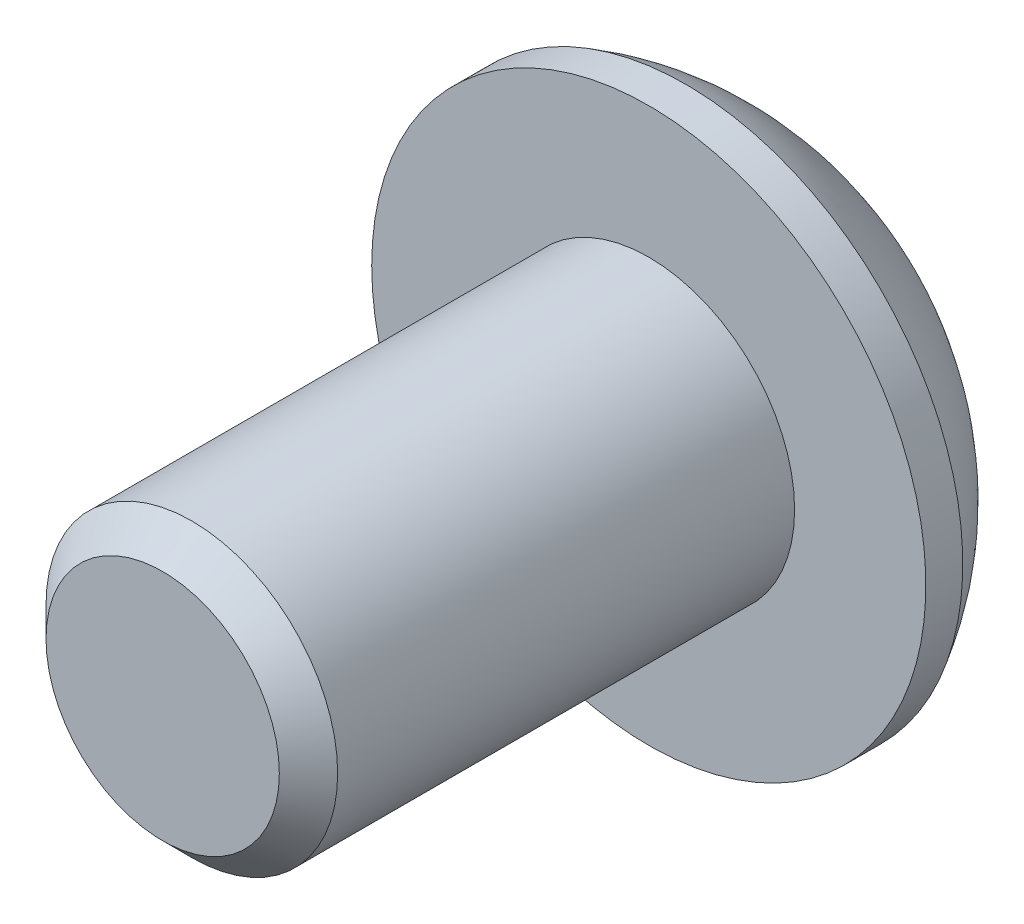
ISO-10303-21;
HEADER;
FILE_DESCRIPTION(('STEP AP214'),'2;1');
FILE_NAME('part.step','',(''),(''),'','','');
FILE_SCHEMA(('AUTOMOTIVE_DESIGN { 1 0 10303 214 1 1 1 1 }'));
ENDSEC;
DATA;
#1=APPLICATION_CONTEXT('core data for automotive mechanical design processes');
#2=APPLICATION_PROTOCOL_DEFINITION('international standard','automotive_design',2000,#1);
#3=PRODUCT_CONTEXT('',#1,'mechanical');
#4=PRODUCT('Part','Part','',(#3));
#5=PRODUCT_RELATED_PRODUCT_CATEGORY('part','',(#4));
#6=PRODUCT_DEFINITION_FORMATION('','',#4);
#7=PRODUCT_DEFINITION_CONTEXT('part definition',#1,'design');
#8=PRODUCT_DEFINITION('design','',#6,#7);
#9=PRODUCT_DEFINITION_SHAPE('','',#8);
#10=(LENGTH_UNIT() NAMED_UNIT(*) SI_UNIT(.MILLI.,.METRE.));
#11=(NAMED_UNIT(*) PLANE_ANGLE_UNIT() SI_UNIT($,.RADIAN.));
#12=(NAMED_UNIT(*) SI_UNIT($,.STERADIAN.) SOLID_ANGLE_UNIT());
#13=UNCERTAINTY_MEASURE_WITH_UNIT(LENGTH_MEASURE(1.E-05),#10,'distance_accuracy_value','');
#14=(GEOMETRIC_REPRESENTATION_CONTEXT(3) GLOBAL_UNCERTAINTY_ASSIGNED_CONTEXT((#13)) GLOBAL_UNIT_ASSIGNED_CONTEXT((#10,
#11,#12)) REPRESENTATION_CONTEXT('',''));
#15=CARTESIAN_POINT('',(0.,0.,0.));
#16=DIRECTION('',(0.,0.,1.));
#17=DIRECTION('',(1.,0.,0.));
#18=AXIS2_PLACEMENT_3D('',#15,#16,#17);
#19=CARTESIAN_POINT('',(0.,0.,-0.84));
#20=DIRECTION('',(0.,0.,1.));
#21=DIRECTION('',(1.,0.,0.));
#22=AXIS2_PLACEMENT_3D('',#19,#20,#21);
#23=PLANE('',#22);
#24=DIRECTION('',(0.,1.,0.));
#25=VECTOR('',#24,1.);
#26=CARTESIAN_POINT('',(-1.,-0.577350269189626,-0.84));
#27=LINE('',#26,#25);
#28=CARTESIAN_POINT('',(-1.,-0.577350269189626,-0.84));
#29=VERTEX_POINT('',#28);
#30=CARTESIAN_POINT('',(-1.,0.577350269189626,-0.84));
#31=VERTEX_POINT('',#30);
#32=EDGE_CURVE('E72',#29,#31,#27,.T.);
#33=ORIENTED_EDGE('',*,*,#32,.T.);
#34=DIRECTION('',(-0.866025403784439,-0.5,0.));
#35=VECTOR('',#34,1.);
#36=CARTESIAN_POINT('',(-1.,0.577350269189626,-0.84));
#37=LINE('',#36,#35);
#38=CARTESIAN_POINT('',(0.,1.15470053837925,-0.84));
#39=VERTEX_POINT('',#38);
#40=EDGE_CURVE('E143',#31,#39,#37,.F.);
#41=ORIENTED_EDGE('',*,*,#40,.T.);
#42=DIRECTION('',(-0.866025403784439,0.5,0.));
#43=VECTOR('',#42,1.);
#44=CARTESIAN_POINT('',(0.,1.15470053837925,-0.84));
#45=LINE('',#44,#43);
#46=CARTESIAN_POINT('',(1.,0.577350269189626,-0.84));
#47=VERTEX_POINT('',#46);
#48=EDGE_CURVE('E150',#39,#47,#45,.F.);
#49=ORIENTED_EDGE('',*,*,#48,.T.);
#50=DIRECTION('',(0.,1.,0.));
#51=VECTOR('',#50,1.);
#52=CARTESIAN_POINT('',(1.,0.577350269189626,-0.84));
#53=LINE('',#52,#51);
#54=CARTESIAN_POINT('',(1.,-0.577350269189626,-0.84));
#55=VERTEX_POINT('',#54);
#56=EDGE_CURVE('E155',#47,#55,#53,.F.);
#57=ORIENTED_EDGE('',*,*,#56,.T.);
#58=DIRECTION('',(0.866025403784439,0.499999999999999,0.));
#59=VECTOR('',#58,1.);
#60=CARTESIAN_POINT('',(1.,-0.577350269189626,-0.84));
#61=LINE('',#60,#59);
#62=CARTESIAN_POINT('',(0.,-1.15470053837925,-0.84));
#63=VERTEX_POINT('',#62);
#64=EDGE_CURVE('E68',#55,#63,#61,.F.);
#65=ORIENTED_EDGE('',*,*,#64,.T.);
#66=DIRECTION('',(0.866025403784438,-0.5,0.));
#67=VECTOR('',#66,1.);
#68=CARTESIAN_POINT('',(0.,-1.15470053837925,-0.84));
#69=LINE('',#68,#67);
#70=EDGE_CURVE('E70',#63,#29,#69,.F.);
#71=ORIENTED_EDGE('',*,*,#70,.T.);
#72=EDGE_LOOP('',(#33,#41,#49,#57,#65,#71));
#73=FACE_BOUND('',#72,.T.);
#74=ADVANCED_FACE('F16',(#73),#23,.F.);
#75=CARTESIAN_POINT('',(-1.,-0.577350269189626,-1.65));
#76=DIRECTION('',(-1.,0.,0.));
#77=DIRECTION('',(0.,0.,1.));
#78=AXIS2_PLACEMENT_3D('',#75,#76,#77);
#79=PLANE('',#78);
#80=ORIENTED_EDGE('',*,*,#32,.F.);
#81=DIRECTION('',(0.,0.,1.));
#82=VECTOR('',#81,1.);
#83=CARTESIAN_POINT('',(-0.999999999999999,-0.577350269189625,-1.65));
#84=LINE('',#83,#82);
#85=CARTESIAN_POINT('',(-1.,-0.577350269189626,-1.65));
#86=VERTEX_POINT('',#85);
#87=EDGE_CURVE('E78',#29,#86,#84,.F.);
#88=ORIENTED_EDGE('',*,*,#87,.T.);
#89=DIRECTION('',(0.,1.,0.));
#90=VECTOR('',#89,1.);
#91=CARTESIAN_POINT('',(-1.,-0.7125,-1.65));
#92=LINE('',#91,#90);
#93=CARTESIAN_POINT('',(-1.,0.577350269189626,-1.65));
#94=VERTEX_POINT('',#93);
#95=EDGE_CURVE('E138',#94,#86,#92,.F.);
#96=ORIENTED_EDGE('',*,*,#95,.F.);
#97=DIRECTION('',(0.,0.,1.));
#98=VECTOR('',#97,1.);
#99=CARTESIAN_POINT('',(-1.,0.577350269189626,-1.65));
#100=LINE('',#99,#98);
#101=EDGE_CURVE('E84',#94,#31,#100,.T.);
#102=ORIENTED_EDGE('',*,*,#101,.T.);
#103=EDGE_LOOP('',(#80,#88,#96,#102));
#104=FACE_BOUND('',#103,.T.);
#105=ADVANCED_FACE('F81',(#104),#79,.F.);
#106=CARTESIAN_POINT('',(0.,-1.15470053837925,-1.65));
#107=DIRECTION('',(-0.5,-0.866025403784438,0.));
#108=DIRECTION('',(0.866025403784438,-0.5,0.));
#109=AXIS2_PLACEMENT_3D('',#106,#107,#108);
#110=PLANE('',#109);
#111=ORIENTED_EDGE('',*,*,#70,.F.);
#112=DIRECTION('',(0.,0.,1.));
#113=VECTOR('',#112,1.);
#114=CARTESIAN_POINT('',(0.,-1.15470053837925,-1.65));
#115=LINE('',#114,#113);
#116=CARTESIAN_POINT('',(0.,-1.15470053837925,-1.65));
#117=VERTEX_POINT('',#116);
#118=EDGE_CURVE('E97',#63,#117,#115,.F.);
#119=ORIENTED_EDGE('',*,*,#118,.T.);
#120=DIRECTION('',(0.866025403784439,-0.499999999999999,0.));
#121=VECTOR('',#120,1.);
#122=CARTESIAN_POINT('',(-1.,-0.577350269189626,-1.65));
#123=LINE('',#122,#121);
#124=EDGE_CURVE('E90',#86,#117,#123,.T.);
#125=ORIENTED_EDGE('',*,*,#124,.F.);
#126=ORIENTED_EDGE('',*,*,#87,.F.);
#127=EDGE_LOOP('',(#111,#119,#125,#126));
#128=FACE_BOUND('',#127,.T.);
#129=ADVANCED_FACE('F88',(#128),#110,.F.);
#130=CARTESIAN_POINT('',(1.,-0.577350269189626,-1.65));
#131=DIRECTION('',(0.499999999999999,-0.866025403784439,0.));
#132=DIRECTION('',(0.866025403784439,0.499999999999999,0.));
#133=AXIS2_PLACEMENT_3D('',#130,#131,#132);
#134=PLANE('',#133);
#135=ORIENTED_EDGE('',*,*,#64,.F.);
#136=DIRECTION('',(0.,0.,-1.));
#137=VECTOR('',#136,1.);
#138=CARTESIAN_POINT('',(1.,-0.577350269189626,-1.65));
#139=LINE('',#138,#137);
#140=CARTESIAN_POINT('',(1.,-0.577350269189626,-1.65));
#141=VERTEX_POINT('',#140);
#142=EDGE_CURVE('E153',#55,#141,#139,.T.);
#143=ORIENTED_EDGE('',*,*,#142,.T.);
#144=DIRECTION('',(0.86602540378444,0.499999999999998,0.));
#145=VECTOR('',#144,1.);
#146=CARTESIAN_POINT('',(0.,-1.15470053837925,-1.65));
#147=LINE('',#146,#145);
#148=EDGE_CURVE('E132',#117,#141,#147,.T.);
#149=ORIENTED_EDGE('',*,*,#148,.F.);
#150=ORIENTED_EDGE('',*,*,#118,.F.);
#151=EDGE_LOOP('',(#135,#143,#149,#150));
#152=FACE_BOUND('',#151,.T.);
#153=ADVANCED_FACE('F160',(#152),#134,.F.);
#154=CARTESIAN_POINT('',(1.,0.577350269189626,-1.65));
#155=DIRECTION('',(1.,0.,0.));
#156=DIRECTION('',(0.,0.,-1.));
#157=AXIS2_PLACEMENT_3D('',#154,#155,#156);
#158=PLANE('',#157);
#159=ORIENTED_EDGE('',*,*,#56,.F.);
#160=DIRECTION('',(0.,0.,1.));
#161=VECTOR('',#160,1.);
#162=CARTESIAN_POINT('',(1.,0.577350269189625,-1.65));
#163=LINE('',#162,#161);
#164=CARTESIAN_POINT('',(1.,0.577350269189626,-1.65));
#165=VERTEX_POINT('',#164);
#166=EDGE_CURVE('E147',#47,#165,#163,.F.);
#167=ORIENTED_EDGE('',*,*,#166,.T.);
#168=DIRECTION('',(0.,1.,0.));
#169=VECTOR('',#168,1.);
#170=CARTESIAN_POINT('',(1.,-0.7125,-1.65));
#171=LINE('',#170,#169);
#172=EDGE_CURVE('E129',#141,#165,#171,.T.);
#173=ORIENTED_EDGE('',*,*,#172,.F.);
#174=ORIENTED_EDGE('',*,*,#142,.F.);
#175=EDGE_LOOP('',(#159,#167,#173,#174));
#176=FACE_BOUND('',#175,.T.);
#177=ADVANCED_FACE('F172',(#176),#158,.F.);
#178=CARTESIAN_POINT('',(0.,1.15470053837925,-1.65));
#179=DIRECTION('',(0.5,0.866025403784439,0.));
#180=DIRECTION('',(-0.866025403784439,0.5,0.));
#181=AXIS2_PLACEMENT_3D('',#178,#179,#180);
#182=PLANE('',#181);
#183=ORIENTED_EDGE('',*,*,#48,.F.);
#184=DIRECTION('',(0.,0.,1.));
#185=VECTOR('',#184,1.);
#186=CARTESIAN_POINT('',(0.,1.15470053837925,-1.65));
#187=LINE('',#186,#185);
#188=CARTESIAN_POINT('',(0.,1.15470053837925,-1.65));
#189=VERTEX_POINT('',#188);
#190=EDGE_CURVE('E35',#39,#189,#187,.F.);
#191=ORIENTED_EDGE('',*,*,#190,.T.);
#192=DIRECTION('',(-0.866025403784439,0.499999999999999,0.));
#193=VECTOR('',#192,1.);
#194=CARTESIAN_POINT('',(1.,0.577350269189626,-1.65));
#195=LINE('',#194,#193);
#196=EDGE_CURVE('E125',#165,#189,#195,.T.);
#197=ORIENTED_EDGE('',*,*,#196,.F.);
#198=ORIENTED_EDGE('',*,*,#166,.F.);
#199=EDGE_LOOP('',(#183,#191,#197,#198));
#200=FACE_BOUND('',#199,.T.);
#201=ADVANCED_FACE('F170',(#200),#182,.F.);
#202=CARTESIAN_POINT('',(-1.,0.577350269189626,-1.65));
#203=DIRECTION('',(-0.5,0.866025403784439,0.));
#204=DIRECTION('',(-0.866025403784439,-0.5,0.));
#205=AXIS2_PLACEMENT_3D('',#202,#203,#204);
#206=PLANE('',#205);
#207=ORIENTED_EDGE('',*,*,#40,.F.);
#208=ORIENTED_EDGE('',*,*,#101,.F.);
#209=DIRECTION('',(-0.866025403784439,-0.499999999999999,0.));
#210=VECTOR('',#209,1.);
#211=CARTESIAN_POINT('',(0.,1.15470053837925,-1.65));
#212=LINE('',#211,#210);
#213=EDGE_CURVE('E119',#189,#94,#212,.T.);
#214=ORIENTED_EDGE('',*,*,#213,.F.);
#215=ORIENTED_EDGE('',*,*,#190,.F.);
#216=EDGE_LOOP('',(#207,#208,#214,#215));
#217=FACE_BOUND('',#216,.T.);
#218=ADVANCED_FACE('F167',(#217),#206,.F.);
#219=CARTESIAN_POINT('',(0.,-0.7125,-1.65));
#220=DIRECTION('',(0.,0.,-1.));
#221=DIRECTION('',(-1.,0.,0.));
#222=AXIS2_PLACEMENT_3D('',#219,#220,#221);
#223=PLANE('',#222);
#224=ORIENTED_EDGE('',*,*,#196,.T.);
#225=ORIENTED_EDGE('',*,*,#213,.T.);
#226=ORIENTED_EDGE('',*,*,#95,.T.);
#227=ORIENTED_EDGE('',*,*,#124,.T.);
#228=ORIENTED_EDGE('',*,*,#148,.T.);
#229=ORIENTED_EDGE('',*,*,#172,.T.);
#230=EDGE_LOOP('',(#224,#225,#226,#227,#228,#229));
#231=FACE_BOUND('',#230,.T.);
#232=CARTESIAN_POINT('',(0.,0.,-1.65));
#233=DIRECTION('',(0.,0.,-1.));
#234=DIRECTION('',(-1.,0.,0.));
#235=AXIS2_PLACEMENT_3D('',#232,#233,#234);
#236=CIRCLE('',#235,1.425);
#237=CARTESIAN_POINT('',(-1.425,0.,-1.65));
#238=VERTEX_POINT('',#237);
#239=EDGE_CURVE('E19',#238,#238,#236,.F.);
#240=ORIENTED_EDGE('',*,*,#239,.F.);
#241=EDGE_LOOP('',(#240));
#242=FACE_BOUND('',#241,.T.);
#243=ADVANCED_FACE('F164',(#231,#242),#223,.T.);
#244=CARTESIAN_POINT('',(0.,0.,1.02727559055118));
#245=DIRECTION('',(0.,0.,-1.));
#246=DIRECTION('',(0.,-1.,0.));
#247=AXIS2_PLACEMENT_3D('',#244,#245,#246);
#248=DEGENERATE_TOROIDAL_SURFACE('',#247,0.317366666666667,2.89735330756749,.T.);
#249=CARTESIAN_POINT('',(0.,0.,-0.380000000000001));
#250=DIRECTION('',(0.,0.,-1.));
#251=DIRECTION('',(-1.,0.,0.));
#252=AXIS2_PLACEMENT_3D('',#249,#250,#251);
#253=CIRCLE('',#252,2.85);
#254=CARTESIAN_POINT('',(-2.85,0.,-0.380000000000001));
#255=VERTEX_POINT('',#254);
#256=EDGE_CURVE('E107',#255,#255,#253,.F.);
#257=ORIENTED_EDGE('',*,*,#256,.F.);
#258=EDGE_LOOP('',(#257));
#259=FACE_BOUND('',#258,.T.);
#260=ORIENTED_EDGE('',*,*,#239,.T.);
#261=EDGE_LOOP('',(#260));
#262=FACE_BOUND('',#261,.T.);
#263=ADVANCED_FACE('F203',(#259,#262),#248,.T.);
#264=CARTESIAN_POINT('',(0.,0.,5.));
#265=DIRECTION('',(0.,0.,1.));
#266=DIRECTION('',(1.,0.,0.));
#267=AXIS2_PLACEMENT_3D('',#264,#265,#266);
#268=PLANE('',#267);
#269=CARTESIAN_POINT('',(0.,0.,5.0000000000523));
#270=DIRECTION('',(0.,0.,-1.));
#271=DIRECTION('',(-1.,0.,0.));
#272=AXIS2_PLACEMENT_3D('',#269,#270,#271);
#273=CIRCLE('',#272,1.19999999992615);
#274=CARTESIAN_POINT('',(-1.19999999992615,0.,5.0000000000523));
#275=VERTEX_POINT('',#274);
#276=EDGE_CURVE('E104',#275,#275,#273,.T.);
#277=ORIENTED_EDGE('',*,*,#276,.F.);
#278=EDGE_LOOP('',(#277));
#279=FACE_BOUND('',#278,.T.);
#280=ADVANCED_FACE('F199',(#279),#268,.T.);
#281=CARTESIAN_POINT('',(0.,0.,-0.19));
#282=DIRECTION('',(0.,0.,-1.));
#283=DIRECTION('',(-1.,0.,0.));
#284=AXIS2_PLACEMENT_3D('',#281,#282,#283);
#285=CYLINDRICAL_SURFACE('',#284,2.85);
#286=CARTESIAN_POINT('',(0.,0.,0.));
#287=DIRECTION('',(0.,0.,-1.));
#288=DIRECTION('',(-1.,0.,0.));
#289=AXIS2_PLACEMENT_3D('',#286,#287,#288);
#290=CIRCLE('',#289,2.85);
#291=CARTESIAN_POINT('',(-2.85,0.,0.));
#292=VERTEX_POINT('',#291);
#293=EDGE_CURVE('E101',#292,#292,#290,.T.);
#294=ORIENTED_EDGE('',*,*,#293,.T.);
#295=EDGE_LOOP('',(#294));
#296=FACE_BOUND('',#295,.T.);
#297=ORIENTED_EDGE('',*,*,#256,.T.);
#298=EDGE_LOOP('',(#297));
#299=FACE_BOUND('',#298,.T.);
#300=ADVANCED_FACE('F195',(#296,#299),#285,.T.);
#301=CARTESIAN_POINT('',(0.,0.,4.70000000007076));
#302=DIRECTION('',(0.,0.,-1.));
#303=DIRECTION('',(-1.,0.,0.));
#304=AXIS2_PLACEMENT_3D('',#301,#302,#303);
#305=CONICAL_SURFACE('',#304,1.49999999990769,0.785398163397448);
#306=CARTESIAN_POINT('',(0.,0.,4.7));
#307=DIRECTION('',(0.,0.,1.));
#308=DIRECTION('',(1.,0.,0.));
#309=AXIS2_PLACEMENT_3D('',#306,#307,#308);
#310=CIRCLE('',#309,1.5);
#311=CARTESIAN_POINT('',(1.5,0.,4.7));
#312=VERTEX_POINT('',#311);
#313=EDGE_CURVE('E26',#312,#312,#310,.F.);
#314=ORIENTED_EDGE('',*,*,#313,.F.);
#315=EDGE_LOOP('',(#314));
#316=FACE_BOUND('',#315,.T.);
#317=ORIENTED_EDGE('',*,*,#276,.T.);
#318=EDGE_LOOP('',(#317));
#319=FACE_BOUND('',#318,.T.);
#320=ADVANCED_FACE('F188',(#316,#319),#305,.T.);
#321=CARTESIAN_POINT('',(0.,-1.425,0.));
#322=DIRECTION('',(0.,0.,-1.));
#323=DIRECTION('',(-1.,0.,0.));
#324=AXIS2_PLACEMENT_3D('',#321,#322,#323);
#325=PLANE('',#324);
#326=CARTESIAN_POINT('',(0.,0.,0.));
#327=DIRECTION('',(0.,0.,1.));
#328=DIRECTION('',(1.,0.,0.));
#329=AXIS2_PLACEMENT_3D('',#326,#327,#328);
#330=CIRCLE('',#329,1.5);
#331=CARTESIAN_POINT('',(1.5,0.,0.));
#332=VERTEX_POINT('',#331);
#333=EDGE_CURVE('E11',#332,#332,#330,.T.);
#334=ORIENTED_EDGE('',*,*,#333,.F.);
#335=EDGE_LOOP('',(#334));
#336=FACE_BOUND('',#335,.T.);
#337=ORIENTED_EDGE('',*,*,#293,.F.);
#338=EDGE_LOOP('',(#337));
#339=FACE_BOUND('',#338,.T.);
#340=ADVANCED_FACE('F183',(#336,#339),#325,.F.);
#341=CARTESIAN_POINT('',(0.,0.,0.));
#342=DIRECTION('',(0.,0.,1.));
#343=DIRECTION('',(1.,0.,0.));
#344=AXIS2_PLACEMENT_3D('',#341,#342,#343);
#345=CYLINDRICAL_SURFACE('',#344,1.5);
#346=ORIENTED_EDGE('',*,*,#333,.T.);
#347=EDGE_LOOP('',(#346));
#348=FACE_BOUND('',#347,.T.);
#349=ORIENTED_EDGE('',*,*,#313,.T.);
#350=EDGE_LOOP('',(#349));
#351=FACE_BOUND('',#350,.T.);
#352=ADVANCED_FACE('F181',(#348,#351),#345,.T.);
#353=CLOSED_SHELL('',(#74,#105,#129,#153,#177,#201,#218,#243,#263,#280,#300,#320,#340,#352));
#354=MANIFOLD_SOLID_BREP('B1',#353);
#355=ADVANCED_BREP_SHAPE_REPRESENTATION('',(#18,#354),#14);
#356=SHAPE_DEFINITION_REPRESENTATION(#9,#355);
ENDSEC;
END-ISO-10303-21;
